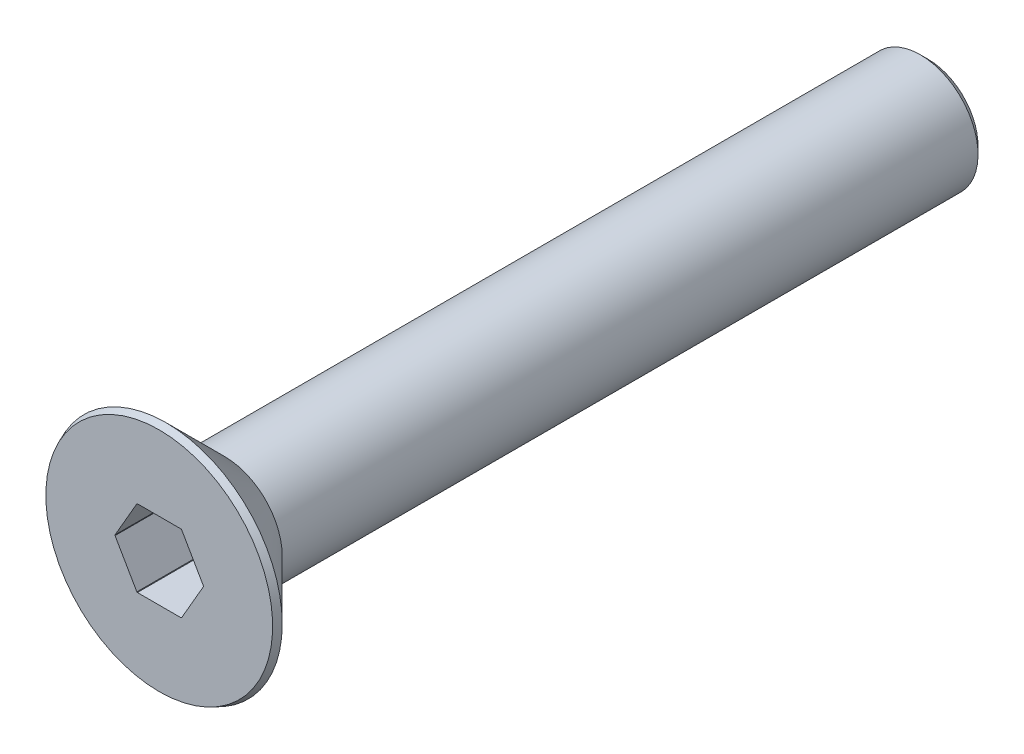
ISO-10303-21;
HEADER;
FILE_DESCRIPTION(('STEP AP214'),'2;1');
FILE_NAME('part.step','',(''),(''),'','','');
FILE_SCHEMA(('AUTOMOTIVE_DESIGN { 1 0 10303 214 1 1 1 1 }'));
ENDSEC;
DATA;
#1=APPLICATION_CONTEXT('core data for automotive mechanical design processes');
#2=APPLICATION_PROTOCOL_DEFINITION('international standard','automotive_design',2000,#1);
#3=PRODUCT_CONTEXT('',#1,'mechanical');
#4=PRODUCT('Part','Part','',(#3));
#5=PRODUCT_RELATED_PRODUCT_CATEGORY('part','',(#4));
#6=PRODUCT_DEFINITION_FORMATION('','',#4);
#7=PRODUCT_DEFINITION_CONTEXT('part definition',#1,'design');
#8=PRODUCT_DEFINITION('design','',#6,#7);
#9=PRODUCT_DEFINITION_SHAPE('','',#8);
#10=(LENGTH_UNIT() NAMED_UNIT(*) SI_UNIT(.MILLI.,.METRE.));
#11=(NAMED_UNIT(*) PLANE_ANGLE_UNIT() SI_UNIT($,.RADIAN.));
#12=(NAMED_UNIT(*) SI_UNIT($,.STERADIAN.) SOLID_ANGLE_UNIT());
#13=UNCERTAINTY_MEASURE_WITH_UNIT(LENGTH_MEASURE(1.E-05),#10,'distance_accuracy_value','');
#14=(GEOMETRIC_REPRESENTATION_CONTEXT(3) GLOBAL_UNCERTAINTY_ASSIGNED_CONTEXT((#13)) GLOBAL_UNIT_ASSIGNED_CONTEXT((#10,
#11,#12)) REPRESENTATION_CONTEXT('',''));
#15=CARTESIAN_POINT('',(0.,0.,0.));
#16=DIRECTION('',(0.,0.,1.));
#17=DIRECTION('',(1.,0.,0.));
#18=AXIS2_PLACEMENT_3D('',#15,#16,#17);
#19=CARTESIAN_POINT('',(0.,0.,-1.7));
#20=DIRECTION('',(0.,0.,1.));
#21=DIRECTION('',(0.,-1.,0.));
#22=AXIS2_PLACEMENT_3D('',#19,#20,#21);
#23=CYLINDRICAL_SURFACE('',#22,1.15);
#24=CARTESIAN_POINT('',(0.,0.,-1.7));
#25=DIRECTION('',(0.,0.,1.));
#26=DIRECTION('',(0.,-1.,0.));
#27=AXIS2_PLACEMENT_3D('',#24,#25,#26);
#28=CIRCLE('',#27,1.15);
#29=CARTESIAN_POINT('',(0.582079986494721,0.991807889322787,-1.69999999999627));
#30=VERTEX_POINT('',#29);
#31=CARTESIAN_POINT('',(0.567890834580014,0.999999999999998,-1.69999999999638));
#32=VERTEX_POINT('',#31);
#33=EDGE_CURVE('E154',#30,#32,#28,.T.);
#34=ORIENTED_EDGE('',*,*,#33,.F.);
#35=DIRECTION('',(0.,0.,1.));
#36=VECTOR('',#35,1.);
#37=CARTESIAN_POINT('',(0.58207998649445,0.991807889323259,1.));
#38=LINE('',#37,#36);
#39=CARTESIAN_POINT('',(0.582079986494721,0.991807889322788,-2.84221464964295E-11));
#40=VERTEX_POINT('',#39);
#41=EDGE_CURVE('E139',#40,#30,#38,.F.);
#42=ORIENTED_EDGE('',*,*,#41,.F.);
#43=CARTESIAN_POINT('',(0.,0.,0.));
#44=DIRECTION('',(0.,0.,-1.));
#45=DIRECTION('',(0.,1.,0.));
#46=AXIS2_PLACEMENT_3D('',#43,#44,#45);
#47=CIRCLE('',#46,1.15);
#48=CARTESIAN_POINT('',(0.56789083458,0.999999999999999,-2.8422143111273E-11));
#49=VERTEX_POINT('',#48);
#50=EDGE_CURVE('E148',#49,#40,#47,.T.);
#51=ORIENTED_EDGE('',*,*,#50,.F.);
#52=DIRECTION('',(0.,0.,-1.));
#53=VECTOR('',#52,1.);
#54=CARTESIAN_POINT('',(0.56789083458,1.,1.));
#55=LINE('',#54,#53);
#56=EDGE_CURVE('E164',#32,#49,#55,.F.);
#57=ORIENTED_EDGE('',*,*,#56,.F.);
#58=EDGE_LOOP('',(#34,#42,#51,#57));
#59=FACE_BOUND('',#58,.T.);
#60=ADVANCED_FACE('F43',(#59),#23,.F.);
#61=CARTESIAN_POINT('',(0.,0.,-1.7));
#62=DIRECTION('',(0.,0.,1.));
#63=DIRECTION('',(0.,-1.,0.));
#64=AXIS2_PLACEMENT_3D('',#61,#62,#63);
#65=CYLINDRICAL_SURFACE('',#64,1.15);
#66=CARTESIAN_POINT('',(0.,0.,-1.7));
#67=DIRECTION('',(0.,0.,1.));
#68=DIRECTION('',(0.,-1.,0.));
#69=AXIS2_PLACEMENT_3D('',#66,#67,#68);
#70=CIRCLE('',#69,1.15);
#71=CARTESIAN_POINT('',(-0.567890834580014,0.999999999999998,-1.69999999999638));
#72=VERTEX_POINT('',#71);
#73=CARTESIAN_POINT('',(-0.582079986493683,0.991807889322995,-1.6999999999964));
#74=VERTEX_POINT('',#73);
#75=EDGE_CURVE('E422',#72,#74,#70,.T.);
#76=ORIENTED_EDGE('',*,*,#75,.F.);
#77=DIRECTION('',(0.,0.,-1.));
#78=VECTOR('',#77,1.);
#79=CARTESIAN_POINT('',(-0.56789083458,1.,1.));
#80=LINE('',#79,#78);
#81=CARTESIAN_POINT('',(-0.56789083458,0.999999999999999,-2.8422143111273E-11));
#82=VERTEX_POINT('',#81);
#83=EDGE_CURVE('E157',#82,#72,#80,.T.);
#84=ORIENTED_EDGE('',*,*,#83,.F.);
#85=CARTESIAN_POINT('',(0.,0.,0.));
#86=DIRECTION('',(0.,0.,-1.));
#87=DIRECTION('',(0.,1.,0.));
#88=AXIS2_PLACEMENT_3D('',#85,#86,#87);
#89=CIRCLE('',#88,1.15);
#90=CARTESIAN_POINT('',(-0.582079986493684,0.991807889322996,-2.84221464964295E-11));
#91=VERTEX_POINT('',#90);
#92=EDGE_CURVE('E309',#91,#82,#89,.T.);
#93=ORIENTED_EDGE('',*,*,#92,.F.);
#94=DIRECTION('',(0.,0.,1.));
#95=VECTOR('',#94,1.);
#96=CARTESIAN_POINT('',(-0.582079986493761,0.991807889322862,1.));
#97=LINE('',#96,#95);
#98=EDGE_CURVE('E208',#74,#91,#97,.T.);
#99=ORIENTED_EDGE('',*,*,#98,.F.);
#100=EDGE_LOOP('',(#76,#84,#93,#99));
#101=FACE_BOUND('',#100,.T.);
#102=ADVANCED_FACE('F448',(#101),#65,.F.);
#103=CARTESIAN_POINT('',(0.,0.,-1.7));
#104=DIRECTION('',(0.,0.,1.));
#105=DIRECTION('',(0.,-1.,0.));
#106=AXIS2_PLACEMENT_3D('',#103,#104,#105);
#107=CYLINDRICAL_SURFACE('',#106,1.15);
#108=CARTESIAN_POINT('',(0.,0.,-1.7));
#109=DIRECTION('',(0.,0.,1.));
#110=DIRECTION('',(0.,-1.,0.));
#111=AXIS2_PLACEMENT_3D('',#108,#109,#110);
#112=CIRCLE('',#111,1.15);
#113=CARTESIAN_POINT('',(-1.1499708210743,0.00819211067716921,-1.69999999999643));
#114=VERTEX_POINT('',#113);
#115=CARTESIAN_POINT('',(-1.14997082107464,-0.00819211067817647,-1.6999999999963));
#116=VERTEX_POINT('',#115);
#117=EDGE_CURVE('E417',#114,#116,#112,.T.);
#118=ORIENTED_EDGE('',*,*,#117,.F.);
#119=DIRECTION('',(0.,0.,1.));
#120=VECTOR('',#119,1.);
#121=CARTESIAN_POINT('',(-1.14997082107415,0.00819211067743609,1.));
#122=LINE('',#121,#120);
#123=CARTESIAN_POINT('',(-1.1499708210743,0.00819211067717038,-2.8421711249418E-11));
#124=VERTEX_POINT('',#123);
#125=EDGE_CURVE('E212',#124,#114,#122,.F.);
#126=ORIENTED_EDGE('',*,*,#125,.F.);
#127=CARTESIAN_POINT('',(0.,0.,0.));
#128=DIRECTION('',(0.,0.,-1.));
#129=DIRECTION('',(0.,1.,0.));
#130=AXIS2_PLACEMENT_3D('',#127,#128,#129);
#131=CIRCLE('',#130,1.15);
#132=CARTESIAN_POINT('',(-1.14997082107464,-0.00819211067817531,-2.842170761139E-11));
#133=VERTEX_POINT('',#132);
#134=EDGE_CURVE('E418',#133,#124,#131,.T.);
#135=ORIENTED_EDGE('',*,*,#134,.F.);
#136=DIRECTION('',(0.,0.,1.));
#137=VECTOR('',#136,1.);
#138=CARTESIAN_POINT('',(-1.14997082107484,-0.00819211067783492,1.));
#139=LINE('',#138,#137);
#140=EDGE_CURVE('E200',#116,#133,#139,.T.);
#141=ORIENTED_EDGE('',*,*,#140,.F.);
#142=EDGE_LOOP('',(#118,#126,#135,#141));
#143=FACE_BOUND('',#142,.T.);
#144=ADVANCED_FACE('F453',(#143),#107,.F.);
#145=CARTESIAN_POINT('',(0.,0.,-1.7));
#146=DIRECTION('',(0.,0.,1.));
#147=DIRECTION('',(0.,-1.,0.));
#148=AXIS2_PLACEMENT_3D('',#145,#146,#147);
#149=CYLINDRICAL_SURFACE('',#148,1.15);
#150=CARTESIAN_POINT('',(0.,0.,-1.7));
#151=DIRECTION('',(0.,0.,1.));
#152=DIRECTION('',(0.,-1.,0.));
#153=AXIS2_PLACEMENT_3D('',#150,#151,#152);
#154=CIRCLE('',#153,1.15);
#155=CARTESIAN_POINT('',(-0.582079986494723,-0.991807889322789,-1.69999999999627));
#156=VERTEX_POINT('',#155);
#157=CARTESIAN_POINT('',(-0.567890834580013,-1.,-1.69999999999637));
#158=VERTEX_POINT('',#157);
#159=EDGE_CURVE('E175',#156,#158,#154,.T.);
#160=ORIENTED_EDGE('',*,*,#159,.F.);
#161=DIRECTION('',(0.,0.,1.));
#162=VECTOR('',#161,1.);
#163=CARTESIAN_POINT('',(-0.58207998649445,-0.991807889323259,1.));
#164=LINE('',#163,#162);
#165=CARTESIAN_POINT('',(-0.582079986494723,-0.991807889322788,-2.84212723643786E-11));
#166=VERTEX_POINT('',#165);
#167=EDGE_CURVE('E204',#166,#156,#164,.F.);
#168=ORIENTED_EDGE('',*,*,#167,.F.);
#169=CARTESIAN_POINT('',(0.,0.,0.));
#170=DIRECTION('',(0.,0.,-1.));
#171=DIRECTION('',(0.,1.,0.));
#172=AXIS2_PLACEMENT_3D('',#169,#170,#171);
#173=CIRCLE('',#172,1.15);
#174=CARTESIAN_POINT('',(-0.567890834580013,-1.,-2.84212705453646E-11));
#175=VERTEX_POINT('',#174);
#176=EDGE_CURVE('E413',#175,#166,#173,.T.);
#177=ORIENTED_EDGE('',*,*,#176,.F.);
#178=DIRECTION('',(0.,0.,1.));
#179=VECTOR('',#178,1.);
#180=CARTESIAN_POINT('',(-0.56789083458,-1.,1.));
#181=LINE('',#180,#179);
#182=EDGE_CURVE('E192',#158,#175,#181,.T.);
#183=ORIENTED_EDGE('',*,*,#182,.F.);
#184=EDGE_LOOP('',(#160,#168,#177,#183));
#185=FACE_BOUND('',#184,.T.);
#186=ADVANCED_FACE('F457',(#185),#149,.F.);
#187=CARTESIAN_POINT('',(0.,0.,-1.7));
#188=DIRECTION('',(0.,0.,1.));
#189=DIRECTION('',(0.,-1.,0.));
#190=AXIS2_PLACEMENT_3D('',#187,#188,#189);
#191=CYLINDRICAL_SURFACE('',#190,1.15);
#192=CARTESIAN_POINT('',(0.,0.,-1.7));
#193=DIRECTION('',(0.,0.,1.));
#194=DIRECTION('',(0.,-1.,0.));
#195=AXIS2_PLACEMENT_3D('',#192,#193,#194);
#196=CIRCLE('',#195,1.15);
#197=CARTESIAN_POINT('',(0.567890834580013,-1.,-1.69999999999637));
#198=VERTEX_POINT('',#197);
#199=CARTESIAN_POINT('',(0.582079986493684,-0.991807889322997,-1.6999999999964));
#200=VERTEX_POINT('',#199);
#201=EDGE_CURVE('E158',#198,#200,#196,.T.);
#202=ORIENTED_EDGE('',*,*,#201,.F.);
#203=DIRECTION('',(0.,0.,1.));
#204=VECTOR('',#203,1.);
#205=CARTESIAN_POINT('',(0.56789083458,-1.,1.));
#206=LINE('',#205,#204);
#207=CARTESIAN_POINT('',(0.567890834580013,-1.,-2.84212705453646E-11));
#208=VERTEX_POINT('',#207);
#209=EDGE_CURVE('E196',#208,#198,#206,.F.);
#210=ORIENTED_EDGE('',*,*,#209,.F.);
#211=CARTESIAN_POINT('',(0.,0.,0.));
#212=DIRECTION('',(0.,0.,-1.));
#213=DIRECTION('',(0.,1.,0.));
#214=AXIS2_PLACEMENT_3D('',#211,#212,#213);
#215=CIRCLE('',#214,1.15);
#216=CARTESIAN_POINT('',(0.582079986493684,-0.991807889322996,-2.84212723643786E-11));
#217=VERTEX_POINT('',#216);
#218=EDGE_CURVE('E166',#217,#208,#215,.T.);
#219=ORIENTED_EDGE('',*,*,#218,.F.);
#220=DIRECTION('',(0.,0.,1.));
#221=VECTOR('',#220,1.);
#222=CARTESIAN_POINT('',(0.582079986493761,-0.991807889322862,1.));
#223=LINE('',#222,#221);
#224=EDGE_CURVE('E187',#200,#217,#223,.T.);
#225=ORIENTED_EDGE('',*,*,#224,.F.);
#226=EDGE_LOOP('',(#202,#210,#219,#225));
#227=FACE_BOUND('',#226,.T.);
#228=ADVANCED_FACE('F475',(#227),#191,.F.);
#229=CARTESIAN_POINT('',(0.57735026919,1.,1.));
#230=DIRECTION('',(-0.866025403784329,-0.50000000000019,0.));
#231=DIRECTION('',(0.50000000000019,-0.866025403784329,0.));
#232=AXIS2_PLACEMENT_3D('',#229,#230,#231);
#233=PLANE('',#232);
#234=CARTESIAN_POINT('',(0.582079986491966,0.991807889327558,-1.69999999999166));
#235=CARTESIAN_POINT('',(0.605600596253279,0.951068998195986,-1.70845815070661));
#236=CARTESIAN_POINT('',(0.629197422105134,0.910198096923238,-1.71614445439344));
#237=CARTESIAN_POINT('',(0.676540507615952,0.828197467431465,-1.72965771299832));
#238=CARTESIAN_POINT('',(0.700286864543365,0.787067570738541,-1.73548329417145));
#239=CARTESIAN_POINT('',(0.747672584468559,0.704993096274919,-1.74490256972869));
#240=CARTESIAN_POINT('',(0.771310925536952,0.66405028853784,-1.74851628107554));
#241=CARTESIAN_POINT('',(0.818641326983931,0.582071628489082,-1.75336238300267));
#242=CARTESIAN_POINT('',(0.842333365384311,0.541035814244772,-1.75459561609425));
#243=CARTESIAN_POINT('',(0.88971744218507,0.458964185756152,-1.75459561609425));
#244=CARTESIAN_POINT('',(0.91340948058545,0.417928371511843,-1.75336238300267));
#245=CARTESIAN_POINT('',(0.960739882032429,0.335949711463085,-1.74851628107555));
#246=CARTESIAN_POINT('',(0.984378223100823,0.295006903726005,-1.7449025697287));
#247=CARTESIAN_POINT('',(1.03176394302602,0.212932429262382,-1.73548329417146));
#248=CARTESIAN_POINT('',(1.05551029995343,0.171802532569459,-1.72965771299833));
#249=CARTESIAN_POINT('',(1.10285338546425,0.0898019030776858,-1.71614445439345));
#250=CARTESIAN_POINT('',(1.1264502113161,0.0489310018049376,-1.70845815070663));
#251=CARTESIAN_POINT('',(1.14997082107742,0.00819211067336481,-1.69999999999168));
#252=B_SPLINE_CURVE_WITH_KNOTS('',3,(#234,#235,#236,#237,#238,#239,#240,#241,#242,#243,#244,
#245,#246,#247,#248,#249,#250,#251),.UNSPECIFIED.,.F.,.F.,(4,2,2,2,2,2,2,2,4),(0.,
0.143400587532756,0.286906802266953,0.429094334758283,0.571231534260703,0.713368733763123,
0.855556266254454,0.999062480988651,1.14246306852141),.UNSPECIFIED.);
#253=CARTESIAN_POINT('',(1.14997082107593,0.00819211067535805,-1.69999999999584));
#254=VERTEX_POINT('',#253);
#255=EDGE_CURVE('E172',#30,#254,#252,.T.);
#256=ORIENTED_EDGE('',*,*,#255,.T.);
#257=DIRECTION('',(0.,0.,1.));
#258=VECTOR('',#257,1.);
#259=CARTESIAN_POINT('',(1.14997082107445,0.0081921106773511,-1.7));
#260=LINE('',#259,#258);
#261=CARTESIAN_POINT('',(1.14997082107219,0.00819211068184096,-2.8421711249418E-11));
#262=VERTEX_POINT('',#261);
#263=EDGE_CURVE('E142',#254,#262,#260,.T.);
#264=ORIENTED_EDGE('',*,*,#263,.T.);
#265=DIRECTION('',(0.50000000000019,-0.866025403784329,0.));
#266=VECTOR('',#265,1.);
#267=CARTESIAN_POINT('',(0.57735026919,0.999999999999999,0.));
#268=LINE('',#267,#266);
#269=EDGE_CURVE('E135',#40,#262,#268,.T.);
#270=ORIENTED_EDGE('',*,*,#269,.F.);
#271=ORIENTED_EDGE('',*,*,#41,.T.);
#272=EDGE_LOOP('',(#256,#264,#270,#271));
#273=FACE_BOUND('',#272,.T.);
#274=ADVANCED_FACE('F137',(#273),#233,.T.);
#275=CARTESIAN_POINT('',(-0.57735026919,1.,1.));
#276=DIRECTION('',(0.,-1.,0.));
#277=DIRECTION('',(0.,0.,-1.));
#278=AXIS2_PLACEMENT_3D('',#275,#276,#277);
#279=PLANE('',#278);
#280=CARTESIAN_POINT('',(-0.567890834585023,0.999999999999998,-1.69999999999185));
#281=CARTESIAN_POINT('',(-0.520849615062434,0.999999999999998,-1.7084581507068));
#282=CARTESIAN_POINT('',(-0.473655963358758,0.999999999999998,-1.71614445439362));
#283=CARTESIAN_POINT('',(-0.378969792337193,0.999999999999998,-1.7296577129985));
#284=CARTESIAN_POINT('',(-0.331477078482403,0.999999999999998,-1.73548329417163));
#285=CARTESIAN_POINT('',(-0.236705638632087,0.999999999999998,-1.74490256972887));
#286=CARTESIAN_POINT('',(-0.189428956495335,0.999999999999998,-1.74851628107571));
#287=CARTESIAN_POINT('',(-0.094768153601448,0.999999999999998,-1.75336238300283));
#288=CARTESIAN_POINT('',(-0.047384076800724,0.999999999999998,-1.75459561609442));
#289=CARTESIAN_POINT('',(0.0473840768007239,0.999999999999998,-1.75459561609442));
#290=CARTESIAN_POINT('',(0.0947681536014478,0.999999999999998,-1.75336238300283));
#291=CARTESIAN_POINT('',(0.189428956495335,0.999999999999998,-1.74851628107571));
#292=CARTESIAN_POINT('',(0.236705638632087,0.999999999999998,-1.74490256972887));
#293=CARTESIAN_POINT('',(0.331477078482403,0.999999999999998,-1.73548329417163));
#294=CARTESIAN_POINT('',(0.378969792337193,0.999999999999998,-1.7296577129985));
#295=CARTESIAN_POINT('',(0.473655963358758,0.999999999999998,-1.71614445439362));
#296=CARTESIAN_POINT('',(0.520849615062434,0.999999999999998,-1.7084581507068));
#297=CARTESIAN_POINT('',(0.567890834585023,0.999999999999998,-1.69999999999185));
#298=B_SPLINE_CURVE_WITH_KNOTS('',3,(#280,#281,#282,#283,#284,#285,#286,#287,#288,#289,#290,
#291,#292,#293,#294,#295,#296,#297),.UNSPECIFIED.,.F.,.F.,(4,2,2,2,2,2,2,2,4),(0.,
0.143400587532703,0.286906802266847,0.429094334758125,0.571231534260492,0.71336873376286,
0.855556266254137,0.999062480988282,1.14246306852098),.UNSPECIFIED.);
#299=EDGE_CURVE('E221',#72,#32,#298,.T.);
#300=ORIENTED_EDGE('',*,*,#299,.T.);
#301=ORIENTED_EDGE('',*,*,#56,.T.);
#302=DIRECTION('',(1.,0.,0.));
#303=VECTOR('',#302,1.);
#304=CARTESIAN_POINT('',(-0.57735026919,0.999999999999999,0.));
#305=LINE('',#304,#303);
#306=EDGE_CURVE('E129',#82,#49,#305,.T.);
#307=ORIENTED_EDGE('',*,*,#306,.F.);
#308=ORIENTED_EDGE('',*,*,#83,.T.);
#309=EDGE_LOOP('',(#300,#301,#307,#308));
#310=FACE_BOUND('',#309,.T.);
#311=ADVANCED_FACE('F219',(#310),#279,.T.);
#312=CARTESIAN_POINT('',(-1.154700538379,0.,1.));
#313=DIRECTION('',(0.866025403784329,-0.50000000000019,0.));
#314=DIRECTION('',(0.50000000000019,0.866025403784329,0.));
#315=AXIS2_PLACEMENT_3D('',#312,#313,#314);
#316=PLANE('',#315);
#317=CARTESIAN_POINT('',(-1.14997082107672,0.00819211067297687,-1.69999999999193));
#318=CARTESIAN_POINT('',(-1.12645021131541,0.0489310018045507,-1.70845815070689));
#319=CARTESIAN_POINT('',(-1.10285338546355,0.0898019030773,-1.71614445439372));
#320=CARTESIAN_POINT('',(-1.05551029995273,0.171802532569076,-1.72965771299861));
#321=CARTESIAN_POINT('',(-1.03176394302532,0.212932429262001,-1.73548329417174));
#322=CARTESIAN_POINT('',(-0.984378223100124,0.295006903725626,-1.74490256972899));
#323=CARTESIAN_POINT('',(-0.96073988203173,0.335949711462707,-1.74851628107584));
#324=CARTESIAN_POINT('',(-0.913409480584749,0.417928371511467,-1.75336238300296));
#325=CARTESIAN_POINT('',(-0.889717442184369,0.458964185755778,-1.75459561609454));
#326=CARTESIAN_POINT('',(-0.842333365383608,0.5410358142444,-1.75459561609454));
#327=CARTESIAN_POINT('',(-0.818641326983228,0.582071628488711,-1.75336238300295));
#328=CARTESIAN_POINT('',(-0.771310925536247,0.664050288537472,-1.74851628107583));
#329=CARTESIAN_POINT('',(-0.747672584467853,0.704993096274552,-1.74490256972897));
#330=CARTESIAN_POINT('',(-0.700286864542658,0.787067570738177,-1.73548329417172));
#331=CARTESIAN_POINT('',(-0.676540507615244,0.828197467431101,-1.72965771299859));
#332=CARTESIAN_POINT('',(-0.629197422104425,0.910198096922877,-1.71614445439369));
#333=CARTESIAN_POINT('',(-0.605600596252569,0.951068998195626,-1.70845815070686));
#334=CARTESIAN_POINT('',(-0.582079986491256,0.991807889327199,-1.6999999999919));
#335=B_SPLINE_CURVE_WITH_KNOTS('',3,(#317,#318,#319,#320,#321,#322,#323,#324,#325,#326,#327,
#328,#329,#330,#331,#332,#333,#334),.UNSPECIFIED.,.F.,.F.,(4,2,2,2,2,2,2,2,4),(0.,
0.143400587532762,0.286906802266966,0.429094334758301,0.571231534260725,0.71336873376315,
0.855556266254485,0.999062480988688,1.14246306852145),.UNSPECIFIED.);
#336=EDGE_CURVE('E225',#114,#74,#335,.T.);
#337=ORIENTED_EDGE('',*,*,#336,.T.);
#338=ORIENTED_EDGE('',*,*,#98,.T.);
#339=DIRECTION('',(0.50000000000019,0.866025403784329,0.));
#340=VECTOR('',#339,1.);
#341=CARTESIAN_POINT('',(-1.154700538379,0.,0.));
#342=LINE('',#341,#340);
#343=EDGE_CURVE('E146',#124,#91,#342,.T.);
#344=ORIENTED_EDGE('',*,*,#343,.F.);
#345=ORIENTED_EDGE('',*,*,#125,.T.);
#346=EDGE_LOOP('',(#337,#338,#344,#345));
#347=FACE_BOUND('',#346,.T.);
#348=ADVANCED_FACE('F284',(#347),#316,.T.);
#349=CARTESIAN_POINT('',(-0.57735026919,-1.,1.));
#350=DIRECTION('',(0.866025403784329,0.50000000000019,0.));
#351=DIRECTION('',(-0.50000000000019,0.866025403784329,0.));
#352=AXIS2_PLACEMENT_3D('',#349,#350,#351);
#353=PLANE('',#352);
#354=CARTESIAN_POINT('',(-0.582079986491968,-0.99180788932756,-1.69999999999166));
#355=CARTESIAN_POINT('',(-0.605600596253279,-0.951068998195989,-1.70845815070661));
#356=CARTESIAN_POINT('',(-0.629197422105134,-0.910198096923243,-1.71614445439343));
#357=CARTESIAN_POINT('',(-0.676540507615949,-0.828197467431475,-1.72965771299832));
#358=CARTESIAN_POINT('',(-0.700286864543361,-0.787067570738554,-1.73548329417145));
#359=CARTESIAN_POINT('',(-0.747672584468552,-0.704993096274935,-1.74490256972869));
#360=CARTESIAN_POINT('',(-0.771310925536944,-0.664050288537858,-1.74851628107554));
#361=CARTESIAN_POINT('',(-0.818641326983921,-0.582071628489105,-1.75336238300266));
#362=CARTESIAN_POINT('',(-0.842333365384299,-0.541035814244797,-1.75459561609425));
#363=CARTESIAN_POINT('',(-0.889717442185056,-0.458964185756182,-1.75459561609425));
#364=CARTESIAN_POINT('',(-0.913409480585435,-0.417928371511874,-1.75336238300267));
#365=CARTESIAN_POINT('',(-0.960739882032412,-0.33594971146312,-1.74851628107555));
#366=CARTESIAN_POINT('',(-0.984378223100804,-0.295006903726043,-1.74490256972871));
#367=CARTESIAN_POINT('',(-1.031763943026,-0.212932429262424,-1.73548329417147));
#368=CARTESIAN_POINT('',(-1.05551029995341,-0.171802532569503,-1.72965771299834));
#369=CARTESIAN_POINT('',(-1.10285338546422,-0.0898019030777332,-1.71614445439346));
#370=CARTESIAN_POINT('',(-1.12645021131608,-0.048931001804987,-1.70845815070664));
#371=CARTESIAN_POINT('',(-1.14997082107739,-0.00819211067341607,-1.69999999999169));
#372=B_SPLINE_CURVE_WITH_KNOTS('',3,(#354,#355,#356,#357,#358,#359,#360,#361,#362,#363,#364,
#365,#366,#367,#368,#369,#370,#371),.UNSPECIFIED.,.F.,.F.,(4,2,2,2,2,2,2,2,4),(0.,
0.143400587532748,0.286906802266938,0.429094334758261,0.571231534260674,0.713368733763087,
0.85555626625441,0.9990624809886,1.14246306852135),.UNSPECIFIED.);
#373=EDGE_CURVE('E232',#156,#116,#372,.T.);
#374=ORIENTED_EDGE('',*,*,#373,.T.);
#375=ORIENTED_EDGE('',*,*,#140,.T.);
#376=DIRECTION('',(0.50000000000019,-0.866025403784329,0.));
#377=VECTOR('',#376,1.);
#378=CARTESIAN_POINT('',(-0.86602540378472,-0.500000000000415,0.));
#379=LINE('',#378,#377);
#380=EDGE_CURVE('E145',#133,#166,#379,.T.);
#381=ORIENTED_EDGE('',*,*,#380,.T.);
#382=ORIENTED_EDGE('',*,*,#167,.T.);
#383=EDGE_LOOP('',(#374,#375,#381,#382));
#384=FACE_BOUND('',#383,.T.);
#385=ADVANCED_FACE('F280',(#384),#353,.T.);
#386=CARTESIAN_POINT('',(0.57735026919,-1.,1.));
#387=DIRECTION('',(0.,1.,0.));
#388=DIRECTION('',(0.,0.,1.));
#389=AXIS2_PLACEMENT_3D('',#386,#387,#388);
#390=PLANE('',#389);
#391=CARTESIAN_POINT('',(0.567890834585023,-1.,-1.69999999999184));
#392=CARTESIAN_POINT('',(0.520849615062434,-1.,-1.7084581507068));
#393=CARTESIAN_POINT('',(0.473655963358758,-1.,-1.71614445439362));
#394=CARTESIAN_POINT('',(0.378969792337193,-1.,-1.7296577129985));
#395=CARTESIAN_POINT('',(0.331477078482403,-1.,-1.73548329417163));
#396=CARTESIAN_POINT('',(0.236705638632087,-1.,-1.74490256972886));
#397=CARTESIAN_POINT('',(0.189428956495335,-1.,-1.74851628107571));
#398=CARTESIAN_POINT('',(0.0947681536014475,-1.,-1.75336238300283));
#399=CARTESIAN_POINT('',(0.0473840768007235,-1.,-1.75459561609441));
#400=CARTESIAN_POINT('',(-0.0473840768007244,-1.,-1.75459561609441));
#401=CARTESIAN_POINT('',(-0.0947681536014484,-1.,-1.75336238300283));
#402=CARTESIAN_POINT('',(-0.189428956495336,-1.,-1.74851628107571));
#403=CARTESIAN_POINT('',(-0.236705638632088,-1.,-1.74490256972886));
#404=CARTESIAN_POINT('',(-0.331477078482404,-1.,-1.73548329417163));
#405=CARTESIAN_POINT('',(-0.378969792337194,-1.,-1.7296577129985));
#406=CARTESIAN_POINT('',(-0.473655963358759,-1.,-1.71614445439362));
#407=CARTESIAN_POINT('',(-0.520849615062435,-1.,-1.7084581507068));
#408=CARTESIAN_POINT('',(-0.567890834585024,-1.,-1.69999999999184));
#409=B_SPLINE_CURVE_WITH_KNOTS('',3,(#391,#392,#393,#394,#395,#396,#397,#398,#399,#400,#401,
#402,#403,#404,#405,#406,#407,#408),.UNSPECIFIED.,.F.,.F.,(4,2,2,2,2,2,2,2,4),(0.,
0.143400587532703,0.286906802266847,0.429094334758125,0.571231534260493,0.71336873376286,
0.855556266254138,0.999062480988282,1.14246306852099),.UNSPECIFIED.);
#410=EDGE_CURVE('E263',#198,#158,#409,.T.);
#411=ORIENTED_EDGE('',*,*,#410,.T.);
#412=ORIENTED_EDGE('',*,*,#182,.T.);
#413=DIRECTION('',(1.,0.,0.));
#414=VECTOR('',#413,1.);
#415=CARTESIAN_POINT('',(0.,-1.,0.));
#416=LINE('',#415,#414);
#417=EDGE_CURVE('E313',#175,#208,#416,.T.);
#418=ORIENTED_EDGE('',*,*,#417,.T.);
#419=ORIENTED_EDGE('',*,*,#209,.T.);
#420=EDGE_LOOP('',(#411,#412,#418,#419));
#421=FACE_BOUND('',#420,.T.);
#422=ADVANCED_FACE('F283',(#421),#390,.T.);
#423=CARTESIAN_POINT('',(1.154700538379,0.,1.));
#424=DIRECTION('',(-0.866025403784329,0.50000000000019,0.));
#425=DIRECTION('',(-0.50000000000019,-0.866025403784329,0.));
#426=AXIS2_PLACEMENT_3D('',#423,#424,#425);
#427=PLANE('',#426);
#428=CARTESIAN_POINT('',(1.14997082107675,-0.00819211067293378,-1.69999999999192));
#429=CARTESIAN_POINT('',(1.12645021131543,-0.0489310018045094,-1.70845815070688));
#430=CARTESIAN_POINT('',(1.10285338546358,-0.0898019030772605,-1.71614445439371));
#431=CARTESIAN_POINT('',(1.05551029995276,-0.17180253256904,-1.7296577129986));
#432=CARTESIAN_POINT('',(1.03176394302534,-0.212932429261967,-1.73548329417174));
#433=CARTESIAN_POINT('',(0.984378223100144,-0.295006903725596,-1.74490256972898));
#434=CARTESIAN_POINT('',(0.960739882031748,-0.335949711462678,-1.74851628107583));
#435=CARTESIAN_POINT('',(0.913409480584766,-0.417928371511442,-1.75336238300296));
#436=CARTESIAN_POINT('',(0.889717442184384,-0.458964185755755,-1.75459561609454));
#437=CARTESIAN_POINT('',(0.842333365383621,-0.541035814244381,-1.75459561609454));
#438=CARTESIAN_POINT('',(0.81864132698324,-0.582071628488694,-1.75336238300295));
#439=CARTESIAN_POINT('',(0.771310925536257,-0.664050288537457,-1.74851628107583));
#440=CARTESIAN_POINT('',(0.747672584467862,-0.704993096274539,-1.74490256972897));
#441=CARTESIAN_POINT('',(0.700286864542665,-0.787067570738168,-1.73548329417172));
#442=CARTESIAN_POINT('',(0.67654050761525,-0.828197467431095,-1.72965771299859));
#443=CARTESIAN_POINT('',(0.629197422104429,-0.910198096922874,-1.71614445439369));
#444=CARTESIAN_POINT('',(0.605600596252571,-0.951068998195625,-1.70845815070686));
#445=CARTESIAN_POINT('',(0.582079986491257,-0.9918078893272,-1.6999999999919));
#446=B_SPLINE_CURVE_WITH_KNOTS('',3,(#428,#429,#430,#431,#432,#433,#434,#435,#436,#437,#438,
#439,#440,#441,#442,#443,#444,#445),.UNSPECIFIED.,.F.,.F.,(4,2,2,2,2,2,2,2,4),(0.,
0.143400587532769,0.286906802266979,0.42909433475832,0.571231534260751,0.713368733763181,
0.855556266254523,0.999062480988733,1.1424630685215),.UNSPECIFIED.);
#447=CARTESIAN_POINT('',(1.1499708210756,-0.00819211067514478,-1.69999999999596));
#448=VERTEX_POINT('',#447);
#449=EDGE_CURVE('E191',#448,#200,#446,.T.);
#450=ORIENTED_EDGE('',*,*,#449,.T.);
#451=ORIENTED_EDGE('',*,*,#224,.T.);
#452=DIRECTION('',(0.50000000000019,0.866025403784329,0.));
#453=VECTOR('',#452,1.);
#454=CARTESIAN_POINT('',(0.866025403784031,-0.500000000000018,0.));
#455=LINE('',#454,#453);
#456=CARTESIAN_POINT('',(1.14997082107222,-0.0081921106773384,-2.842170761139E-11));
#457=VERTEX_POINT('',#456);
#458=EDGE_CURVE('E60',#217,#457,#455,.T.);
#459=ORIENTED_EDGE('',*,*,#458,.T.);
#460=DIRECTION('',(0.,0.,1.));
#461=VECTOR('',#460,1.);
#462=CARTESIAN_POINT('',(1.14997082107445,-0.00819211067735579,-1.7));
#463=LINE('',#462,#461);
#464=EDGE_CURVE('E171',#457,#448,#463,.F.);
#465=ORIENTED_EDGE('',*,*,#464,.T.);
#466=EDGE_LOOP('',(#450,#451,#459,#465));
#467=FACE_BOUND('',#466,.T.);
#468=ADVANCED_FACE('F256',(#467),#427,.T.);
#469=CARTESIAN_POINT('',(0.,0.,-1.70000000005643));
#470=DIRECTION('',(0.,0.,1.));
#471=DIRECTION('',(0.,-1.,0.));
#472=AXIS2_PLACEMENT_3D('',#469,#470,#471);
#473=CONICAL_SURFACE('',#472,1.14999999982501,1.22172999978934);
#474=CARTESIAN_POINT('',(0.,0.,-1.7));
#475=DIRECTION('',(0.,0.,1.));
#476=DIRECTION('',(0.,-1.,0.));
#477=AXIS2_PLACEMENT_3D('',#474,#475,#476);
#478=CIRCLE('',#477,1.15);
#479=EDGE_CURVE('E185',#448,#254,#478,.T.);
#480=ORIENTED_EDGE('',*,*,#479,.T.);
#481=ORIENTED_EDGE('',*,*,#255,.F.);
#482=ORIENTED_EDGE('',*,*,#33,.T.);
#483=ORIENTED_EDGE('',*,*,#299,.F.);
#484=ORIENTED_EDGE('',*,*,#75,.T.);
#485=ORIENTED_EDGE('',*,*,#336,.F.);
#486=ORIENTED_EDGE('',*,*,#117,.T.);
#487=ORIENTED_EDGE('',*,*,#373,.F.);
#488=ORIENTED_EDGE('',*,*,#159,.T.);
#489=ORIENTED_EDGE('',*,*,#410,.F.);
#490=ORIENTED_EDGE('',*,*,#201,.T.);
#491=ORIENTED_EDGE('',*,*,#449,.F.);
#492=EDGE_LOOP('',(#480,#481,#482,#483,#484,#485,#486,#487,#488,#489,#490,#491));
#493=FACE_BOUND('',#492,.T.);
#494=CARTESIAN_POINT('',(-3.41060513164848E-10,0.,-2.11856638998142));
#495=VERTEX_POINT('',#494);
#496=VERTEX_LOOP('',#495);
#497=FACE_BOUND('',#496,.T.);
#498=ADVANCED_FACE('F250',(#493,#497),#473,.F.);
#499=CARTESIAN_POINT('',(0.,0.,-1.7));
#500=DIRECTION('',(0.,0.,1.));
#501=DIRECTION('',(0.,-1.,0.));
#502=AXIS2_PLACEMENT_3D('',#499,#500,#501);
#503=CYLINDRICAL_SURFACE('',#502,1.15);
#504=ORIENTED_EDGE('',*,*,#479,.F.);
#505=ORIENTED_EDGE('',*,*,#464,.F.);
#506=CARTESIAN_POINT('',(0.,0.,0.));
#507=DIRECTION('',(0.,0.,1.));
#508=DIRECTION('',(0.,-1.,0.));
#509=AXIS2_PLACEMENT_3D('',#506,#507,#508);
#510=CIRCLE('',#509,1.15);
#511=EDGE_CURVE('E363',#457,#262,#510,.T.);
#512=ORIENTED_EDGE('',*,*,#511,.T.);
#513=ORIENTED_EDGE('',*,*,#263,.F.);
#514=EDGE_LOOP('',(#504,#505,#512,#513));
#515=FACE_BOUND('',#514,.T.);
#516=ADVANCED_FACE('F255',(#515),#503,.F.);
#517=CARTESIAN_POINT('',(0.,0.,0.));
#518=DIRECTION('',(0.,0.,-1.));
#519=DIRECTION('',(0.,1.,0.));
#520=AXIS2_PLACEMENT_3D('',#517,#518,#519);
#521=PLANE('',#520);
#522=CARTESIAN_POINT('',(0.,0.,0.));
#523=DIRECTION('',(0.,0.,-1.));
#524=DIRECTION('',(0.,1.,0.));
#525=AXIS2_PLACEMENT_3D('',#522,#523,#524);
#526=CIRCLE('',#525,2.94999944438245);
#527=CARTESIAN_POINT('',(0.,2.94999944438245,0.));
#528=VERTEX_POINT('',#527);
#529=EDGE_CURVE('E319',#528,#528,#526,.F.);
#530=ORIENTED_EDGE('',*,*,#529,.T.);
#531=EDGE_LOOP('',(#530));
#532=FACE_BOUND('',#531,.T.);
#533=ORIENTED_EDGE('',*,*,#511,.F.);
#534=ORIENTED_EDGE('',*,*,#458,.F.);
#535=ORIENTED_EDGE('',*,*,#218,.T.);
#536=ORIENTED_EDGE('',*,*,#417,.F.);
#537=ORIENTED_EDGE('',*,*,#176,.T.);
#538=ORIENTED_EDGE('',*,*,#380,.F.);
#539=ORIENTED_EDGE('',*,*,#134,.T.);
#540=ORIENTED_EDGE('',*,*,#343,.T.);
#541=ORIENTED_EDGE('',*,*,#92,.T.);
#542=ORIENTED_EDGE('',*,*,#306,.T.);
#543=ORIENTED_EDGE('',*,*,#50,.T.);
#544=ORIENTED_EDGE('',*,*,#269,.T.);
#545=EDGE_LOOP('',(#533,#534,#535,#536,#537,#538,#539,#540,#541,#542,#543,#544));
#546=FACE_BOUND('',#545,.T.);
#547=ADVANCED_FACE('F149',(#532,#546),#521,.F.);
#548=CARTESIAN_POINT('',(0.,0.,-0.176776724288175));
#549=DIRECTION('',(0.,0.,1.));
#550=DIRECTION('',(0.,-1.,0.));
#551=AXIS2_PLACEMENT_3D('',#548,#549,#550);
#552=CONICAL_SURFACE('',#551,3.02322277792655,0.785398000001212);
#553=CARTESIAN_POINT('',(0.,0.,-0.176776724231332));
#554=DIRECTION('',(0.,0.,1.));
#555=DIRECTION('',(0.,-1.,0.));
#556=AXIS2_PLACEMENT_3D('',#553,#554,#555);
#557=CIRCLE('',#556,3.02322277798339);
#558=CARTESIAN_POINT('',(0.,-3.02322277798339,-0.17677672423133));
#559=VERTEX_POINT('',#558);
#560=EDGE_CURVE('E322',#559,#559,#557,.F.);
#561=ORIENTED_EDGE('',*,*,#560,.T.);
#562=EDGE_LOOP('',(#561));
#563=FACE_BOUND('',#562,.T.);
#564=CARTESIAN_POINT('',(0.,0.,-1.7));
#565=DIRECTION('',(0.,0.,-1.));
#566=DIRECTION('',(0.,1.,0.));
#567=AXIS2_PLACEMENT_3D('',#564,#565,#566);
#568=CIRCLE('',#567,1.5);
#569=CARTESIAN_POINT('',(0.,1.5,-1.7));
#570=VERTEX_POINT('',#569);
#571=EDGE_CURVE('E314',#570,#570,#568,.T.);
#572=ORIENTED_EDGE('',*,*,#571,.F.);
#573=EDGE_LOOP('',(#572));
#574=FACE_BOUND('',#573,.T.);
#575=ADVANCED_FACE('F339',(#563,#574),#552,.T.);
#576=CARTESIAN_POINT('',(0.,0.,-1.7));
#577=DIRECTION('',(0.,0.,-1.));
#578=DIRECTION('',(0.,1.,0.));
#579=AXIS2_PLACEMENT_3D('',#576,#577,#578);
#580=CYLINDRICAL_SURFACE('',#579,1.5);
#581=CARTESIAN_POINT('',(0.,0.,-19.8));
#582=DIRECTION('',(0.,0.,-1.));
#583=DIRECTION('',(0.,1.,0.));
#584=AXIS2_PLACEMENT_3D('',#581,#582,#583);
#585=CIRCLE('',#584,1.5);
#586=CARTESIAN_POINT('',(0.,1.49999999999999,-19.8));
#587=VERTEX_POINT('',#586);
#588=EDGE_CURVE('E13',#587,#587,#585,.F.);
#589=ORIENTED_EDGE('',*,*,#588,.T.);
#590=EDGE_LOOP('',(#589));
#591=FACE_BOUND('',#590,.T.);
#592=ORIENTED_EDGE('',*,*,#571,.T.);
#593=EDGE_LOOP('',(#592));
#594=FACE_BOUND('',#593,.T.);
#595=ADVANCED_FACE('F337',(#591,#594),#580,.T.);
#596=CARTESIAN_POINT('',(0.,0.,0.));
#597=DIRECTION('',(0.,0.,-1.));
#598=DIRECTION('',(0.,1.,0.));
#599=AXIS2_PLACEMENT_3D('',#596,#597,#598);
#600=CONICAL_SURFACE('',#599,2.94999944438245,0.392699163359146);
#601=ORIENTED_EDGE('',*,*,#560,.F.);
#602=EDGE_LOOP('',(#601));
#603=FACE_BOUND('',#602,.T.);
#604=ORIENTED_EDGE('',*,*,#529,.F.);
#605=EDGE_LOOP('',(#604));
#606=FACE_BOUND('',#605,.T.);
#607=ADVANCED_FACE('F334',(#603,#606),#600,.T.);
#608=CARTESIAN_POINT('',(0.,0.,-20.));
#609=DIRECTION('',(0.,0.,-1.));
#610=DIRECTION('',(0.,1.,0.));
#611=AXIS2_PLACEMENT_3D('',#608,#609,#610);
#612=PLANE('',#611);
#613=CARTESIAN_POINT('',(0.,0.,-20.));
#614=DIRECTION('',(0.,0.,-1.));
#615=DIRECTION('',(0.,1.,0.));
#616=AXIS2_PLACEMENT_3D('',#613,#614,#615);
#617=CIRCLE('',#616,1.3);
#618=CARTESIAN_POINT('',(0.,1.29999999999999,-20.));
#619=VERTEX_POINT('',#618);
#620=EDGE_CURVE('E52',#619,#619,#617,.T.);
#621=ORIENTED_EDGE('',*,*,#620,.T.);
#622=EDGE_LOOP('',(#621));
#623=FACE_BOUND('',#622,.T.);
#624=ADVANCED_FACE('F327',(#623),#612,.T.);
#625=CARTESIAN_POINT('',(0.,0.,-20.));
#626=DIRECTION('',(0.,0.,1.));
#627=DIRECTION('',(0.,-1.,0.));
#628=AXIS2_PLACEMENT_3D('',#625,#626,#627);
#629=CONICAL_SURFACE('',#628,1.3,0.785398163397447);
#630=ORIENTED_EDGE('',*,*,#588,.F.);
#631=EDGE_LOOP('',(#630));
#632=FACE_BOUND('',#631,.T.);
#633=ORIENTED_EDGE('',*,*,#620,.F.);
#634=EDGE_LOOP('',(#633));
#635=FACE_BOUND('',#634,.T.);
#636=ADVANCED_FACE('F45',(#632,#635),#629,.T.);
#637=CLOSED_SHELL('',(#60,#102,#144,#186,#228,#274,#311,#348,#385,#422,#468,#498,#516,#547,#575,
#595,#607,#624,#636));
#638=MANIFOLD_SOLID_BREP('B2',#637);
#639=ADVANCED_BREP_SHAPE_REPRESENTATION('',(#18,#638),#14);
#640=SHAPE_DEFINITION_REPRESENTATION(#9,#639);
ENDSEC;
END-ISO-10303-21;
